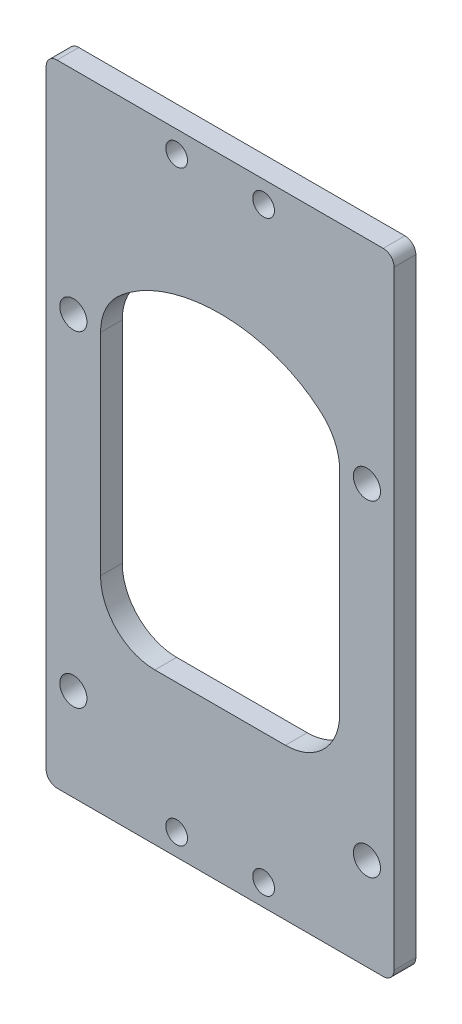
ISO-10303-21;
HEADER;
FILE_DESCRIPTION(('STEP AP214'),'2;1');
FILE_NAME('part.step','',(''),(''),'','','');
FILE_SCHEMA(('AUTOMOTIVE_DESIGN { 1 0 10303 214 1 1 1 1 }'));
ENDSEC;
DATA;
#1=APPLICATION_CONTEXT('core data for automotive mechanical design processes');
#2=APPLICATION_PROTOCOL_DEFINITION('international standard','automotive_design',2000,#1);
#3=PRODUCT_CONTEXT('',#1,'mechanical');
#4=PRODUCT('Part','Part','',(#3));
#5=PRODUCT_RELATED_PRODUCT_CATEGORY('part','',(#4));
#6=PRODUCT_DEFINITION_FORMATION('','',#4);
#7=PRODUCT_DEFINITION_CONTEXT('part definition',#1,'design');
#8=PRODUCT_DEFINITION('design','',#6,#7);
#9=PRODUCT_DEFINITION_SHAPE('','',#8);
#10=(LENGTH_UNIT() NAMED_UNIT(*) SI_UNIT(.MILLI.,.METRE.));
#11=(NAMED_UNIT(*) PLANE_ANGLE_UNIT() SI_UNIT($,.RADIAN.));
#12=(NAMED_UNIT(*) SI_UNIT($,.STERADIAN.) SOLID_ANGLE_UNIT());
#13=UNCERTAINTY_MEASURE_WITH_UNIT(LENGTH_MEASURE(1.E-05),#10,'distance_accuracy_value','');
#14=(GEOMETRIC_REPRESENTATION_CONTEXT(3) GLOBAL_UNCERTAINTY_ASSIGNED_CONTEXT((#13)) GLOBAL_UNIT_ASSIGNED_CONTEXT((#10,
#11,#12)) REPRESENTATION_CONTEXT('',''));
#15=CARTESIAN_POINT('',(0.,0.,0.));
#16=DIRECTION('',(0.,0.,1.));
#17=DIRECTION('',(1.,0.,0.));
#18=AXIS2_PLACEMENT_3D('',#15,#16,#17);
#19=CARTESIAN_POINT('',(-32.0000000000001,37.3006564364788,2.));
#20=DIRECTION('',(1.,0.,0.));
#21=DIRECTION('',(0.,1.,0.));
#22=AXIS2_PLACEMENT_3D('',#19,#20,#21);
#23=PLANE('',#22);
#24=DIRECTION('',(0.,-1.,0.));
#25=VECTOR('',#24,1.);
#26=CARTESIAN_POINT('',(-32.0000000000001,37.3006564364788,0.));
#27=LINE('',#26,#25);
#28=CARTESIAN_POINT('',(-32.0000000000002,50.9999999999999,0.));
#29=VERTEX_POINT('',#28);
#30=CARTESIAN_POINT('',(-32.,-5.,0.));
#31=VERTEX_POINT('',#30);
#32=EDGE_CURVE('E226',#29,#31,#27,.T.);
#33=ORIENTED_EDGE('',*,*,#32,.T.);
#34=DIRECTION('',(0.,0.,1.));
#35=VECTOR('',#34,1.);
#36=CARTESIAN_POINT('',(-32.,-5.,2.));
#37=LINE('',#36,#35);
#38=CARTESIAN_POINT('',(-32.,-5.,2.));
#39=VERTEX_POINT('',#38);
#40=EDGE_CURVE('E11',#31,#39,#37,.T.);
#41=ORIENTED_EDGE('',*,*,#40,.T.);
#42=DIRECTION('',(0.,-1.,0.));
#43=VECTOR('',#42,1.);
#44=CARTESIAN_POINT('',(-32.0000000000001,37.3006564364788,2.));
#45=LINE('',#44,#43);
#46=CARTESIAN_POINT('',(-32.0000000000002,50.9999999999999,2.));
#47=VERTEX_POINT('',#46);
#48=EDGE_CURVE('E228',#47,#39,#45,.T.);
#49=ORIENTED_EDGE('',*,*,#48,.F.);
#50=DIRECTION('',(0.,0.,-1.));
#51=VECTOR('',#50,1.);
#52=CARTESIAN_POINT('',(-32.0000000000002,50.9999999999999,0.));
#53=LINE('',#52,#51);
#54=EDGE_CURVE('E41',#47,#29,#53,.T.);
#55=ORIENTED_EDGE('',*,*,#54,.T.);
#56=EDGE_LOOP('',(#33,#41,#49,#55));
#57=FACE_BOUND('',#56,.T.);
#58=ADVANCED_FACE('F33',(#57),#23,.F.);
#59=CARTESIAN_POINT('',(10.932058708054,48.7327289101683,2.));
#60=DIRECTION('',(0.,0.,1.));
#61=DIRECTION('',(1.,0.,0.));
#62=AXIS2_PLACEMENT_3D('',#59,#60,#61);
#63=PLANE('',#62);
#64=CARTESIAN_POINT('',(-12.0000000000001,-4.,2.));
#65=DIRECTION('',(0.,0.,1.));
#66=DIRECTION('',(1.,0.,0.));
#67=AXIS2_PLACEMENT_3D('',#64,#65,#66);
#68=CIRCLE('',#67,1.);
#69=CARTESIAN_POINT('',(-11.0000000000001,-4.,2.));
#70=VERTEX_POINT('',#69);
#71=EDGE_CURVE('E436',#70,#70,#68,.T.);
#72=ORIENTED_EDGE('',*,*,#71,.F.);
#73=EDGE_LOOP('',(#72));
#74=FACE_BOUND('',#73,.T.);
#75=CARTESIAN_POINT('',(-20.0000000000001,-4.,2.));
#76=DIRECTION('',(0.,0.,1.));
#77=DIRECTION('',(1.,0.,0.));
#78=AXIS2_PLACEMENT_3D('',#75,#76,#77);
#79=CIRCLE('',#78,1.);
#80=CARTESIAN_POINT('',(-19.0000000000001,-4.,2.));
#81=VERTEX_POINT('',#80);
#82=EDGE_CURVE('E430',#81,#81,#79,.T.);
#83=ORIENTED_EDGE('',*,*,#82,.F.);
#84=EDGE_LOOP('',(#83));
#85=FACE_BOUND('',#84,.T.);
#86=CARTESIAN_POINT('',(-20.0000000000001,49.9999999999999,2.));
#87=DIRECTION('',(0.,0.,-1.));
#88=DIRECTION('',(-1.,0.,0.));
#89=AXIS2_PLACEMENT_3D('',#86,#87,#88);
#90=CIRCLE('',#89,1.);
#91=CARTESIAN_POINT('',(-21.0000000000001,49.9999999999999,2.));
#92=VERTEX_POINT('',#91);
#93=EDGE_CURVE('E416',#92,#92,#90,.T.);
#94=ORIENTED_EDGE('',*,*,#93,.T.);
#95=EDGE_LOOP('',(#94));
#96=FACE_BOUND('',#95,.T.);
#97=CARTESIAN_POINT('',(-12.0000000000001,49.9999999999999,2.));
#98=DIRECTION('',(0.,0.,-1.));
#99=DIRECTION('',(-1.,0.,0.));
#100=AXIS2_PLACEMENT_3D('',#97,#98,#99);
#101=CIRCLE('',#100,1.);
#102=CARTESIAN_POINT('',(-13.0000000000001,49.9999999999999,2.));
#103=VERTEX_POINT('',#102);
#104=EDGE_CURVE('E409',#103,#103,#101,.T.);
#105=ORIENTED_EDGE('',*,*,#104,.T.);
#106=EDGE_LOOP('',(#105));
#107=FACE_BOUND('',#106,.T.);
#108=DIRECTION('',(0.,-1.,0.));
#109=VECTOR('',#108,1.);
#110=CARTESIAN_POINT('',(0.,37.3006564364788,2.));
#111=LINE('',#110,#109);
#112=CARTESIAN_POINT('',(0.,50.9999999999999,2.));
#113=VERTEX_POINT('',#112);
#114=CARTESIAN_POINT('',(0.,-5.,2.));
#115=VERTEX_POINT('',#114);
#116=EDGE_CURVE('E238',#113,#115,#111,.T.);
#117=ORIENTED_EDGE('',*,*,#116,.F.);
#118=CARTESIAN_POINT('',(-1.00000000000001,50.9999999999999,2.));
#119=DIRECTION('',(0.,0.,1.));
#120=DIRECTION('',(1.,0.,0.));
#121=AXIS2_PLACEMENT_3D('',#118,#119,#120);
#122=CIRCLE('',#121,1.);
#123=CARTESIAN_POINT('',(-1.00000000000001,51.9999999999999,2.));
#124=VERTEX_POINT('',#123);
#125=EDGE_CURVE('E215',#113,#124,#122,.T.);
#126=ORIENTED_EDGE('',*,*,#125,.T.);
#127=DIRECTION('',(1.,0.,0.));
#128=VECTOR('',#127,1.);
#129=CARTESIAN_POINT('',(0.,51.9999999999999,2.));
#130=LINE('',#129,#128);
#131=CARTESIAN_POINT('',(-31.0000000000002,51.9999999999999,2.));
#132=VERTEX_POINT('',#131);
#133=EDGE_CURVE('E169',#132,#124,#130,.T.);
#134=ORIENTED_EDGE('',*,*,#133,.F.);
#135=CARTESIAN_POINT('',(-31.0000000000002,50.9999999999999,2.));
#136=DIRECTION('',(0.,0.,1.));
#137=DIRECTION('',(1.,0.,0.));
#138=AXIS2_PLACEMENT_3D('',#135,#136,#137);
#139=CIRCLE('',#138,1.);
#140=EDGE_CURVE('E211',#132,#47,#139,.T.);
#141=ORIENTED_EDGE('',*,*,#140,.T.);
#142=ORIENTED_EDGE('',*,*,#48,.T.);
#143=CARTESIAN_POINT('',(-31.,-5.,2.));
#144=DIRECTION('',(0.,0.,1.));
#145=DIRECTION('',(1.,0.,0.));
#146=AXIS2_PLACEMENT_3D('',#143,#144,#145);
#147=CIRCLE('',#146,1.);
#148=CARTESIAN_POINT('',(-31.,-6.,2.));
#149=VERTEX_POINT('',#148);
#150=EDGE_CURVE('E56',#39,#149,#147,.T.);
#151=ORIENTED_EDGE('',*,*,#150,.T.);
#152=DIRECTION('',(1.,0.,0.));
#153=VECTOR('',#152,1.);
#154=CARTESIAN_POINT('',(-32.0000000000001,-6.,2.));
#155=LINE('',#154,#153);
#156=CARTESIAN_POINT('',(-0.999999999999997,-6.,2.));
#157=VERTEX_POINT('',#156);
#158=EDGE_CURVE('E425',#149,#157,#155,.T.);
#159=ORIENTED_EDGE('',*,*,#158,.T.);
#160=CARTESIAN_POINT('',(-0.999999999999997,-5.,2.));
#161=DIRECTION('',(0.,0.,1.));
#162=DIRECTION('',(1.,0.,0.));
#163=AXIS2_PLACEMENT_3D('',#160,#161,#162);
#164=CIRCLE('',#163,1.);
#165=EDGE_CURVE('E48',#157,#115,#164,.T.);
#166=ORIENTED_EDGE('',*,*,#165,.T.);
#167=EDGE_LOOP('',(#117,#126,#134,#141,#142,#151,#159,#166));
#168=FACE_BOUND('',#167,.T.);
#169=CARTESIAN_POINT('',(-6.46446609406726,35.8361903424116,2.));
#170=CARTESIAN_POINT('',(-10.2644660940673,39.4148025629861,2.));
#171=CARTESIAN_POINT('',(-16.,40.3095891752314,2.));
#172=CARTESIAN_POINT('',(-21.7355339059327,39.4148025629861,2.));
#173=CARTESIAN_POINT('',(-25.5355339059327,35.8361903424116,2.));
#174=B_SPLINE_CURVE_WITH_KNOTS('',4,(#169,#170,#171,#172,#173),.UNSPECIFIED.,.F.,.F.,(5,5),(0.,
1.),.UNSPECIFIED.);
#175=CARTESIAN_POINT('',(-6.86985714354755,36.1996570389666,2.));
#176=VERTEX_POINT('',#175);
#177=CARTESIAN_POINT('',(-25.1301428564524,36.1996570389666,2.));
#178=VERTEX_POINT('',#177);
#179=EDGE_CURVE('E152',#176,#178,#174,.T.);
#180=ORIENTED_EDGE('',*,*,#179,.F.);
#181=CARTESIAN_POINT('',(-10.,32.3006564364789,2.));
#182=DIRECTION('',(0.,0.,1.));
#183=DIRECTION('',(1.,0.,0.));
#184=AXIS2_PLACEMENT_3D('',#181,#182,#183);
#185=CIRCLE('',#184,5.);
#186=CARTESIAN_POINT('',(-5.,32.3006564364789,2.));
#187=VERTEX_POINT('',#186);
#188=EDGE_CURVE('E164',#176,#187,#185,.F.);
#189=ORIENTED_EDGE('',*,*,#188,.T.);
#190=DIRECTION('',(0.,1.,0.));
#191=VECTOR('',#190,1.);
#192=CARTESIAN_POINT('',(-5.,37.3006564364788,2.));
#193=LINE('',#192,#191);
#194=CARTESIAN_POINT('',(-5.,12.9226186855977,2.));
#195=VERTEX_POINT('',#194);
#196=EDGE_CURVE('E274',#195,#187,#193,.T.);
#197=ORIENTED_EDGE('',*,*,#196,.F.);
#198=CARTESIAN_POINT('',(-10.,12.9226186855977,2.));
#199=DIRECTION('',(0.,0.,1.));
#200=DIRECTION('',(1.,0.,0.));
#201=AXIS2_PLACEMENT_3D('',#198,#199,#200);
#202=CIRCLE('',#201,5.);
#203=CARTESIAN_POINT('',(-10.,7.9226186855977,2.));
#204=VERTEX_POINT('',#203);
#205=EDGE_CURVE('E178',#195,#204,#202,.F.);
#206=ORIENTED_EDGE('',*,*,#205,.T.);
#207=DIRECTION('',(1.,0.,0.));
#208=VECTOR('',#207,1.);
#209=CARTESIAN_POINT('',(-5.,7.9226186855977,2.));
#210=LINE('',#209,#208);
#211=CARTESIAN_POINT('',(-22.,7.9226186855977,2.));
#212=VERTEX_POINT('',#211);
#213=EDGE_CURVE('E281',#212,#204,#210,.T.);
#214=ORIENTED_EDGE('',*,*,#213,.F.);
#215=CARTESIAN_POINT('',(-22.,12.9226186855977,2.));
#216=DIRECTION('',(0.,0.,1.));
#217=DIRECTION('',(1.,0.,0.));
#218=AXIS2_PLACEMENT_3D('',#215,#216,#217);
#219=CIRCLE('',#218,5.);
#220=CARTESIAN_POINT('',(-27.,12.9226186855977,2.));
#221=VERTEX_POINT('',#220);
#222=EDGE_CURVE('E187',#212,#221,#219,.F.);
#223=ORIENTED_EDGE('',*,*,#222,.T.);
#224=DIRECTION('',(0.,-1.,0.));
#225=VECTOR('',#224,1.);
#226=CARTESIAN_POINT('',(-27.,37.3006564364788,2.));
#227=LINE('',#226,#225);
#228=CARTESIAN_POINT('',(-27.,32.3006564364789,2.));
#229=VERTEX_POINT('',#228);
#230=EDGE_CURVE('E264',#229,#221,#227,.T.);
#231=ORIENTED_EDGE('',*,*,#230,.F.);
#232=CARTESIAN_POINT('',(-22.,32.3006564364789,2.));
#233=DIRECTION('',(0.,0.,1.));
#234=DIRECTION('',(1.,0.,0.));
#235=AXIS2_PLACEMENT_3D('',#232,#233,#234);
#236=CIRCLE('',#235,5.);
#237=EDGE_CURVE('E168',#229,#178,#236,.F.);
#238=ORIENTED_EDGE('',*,*,#237,.T.);
#239=EDGE_LOOP('',(#180,#189,#197,#206,#214,#223,#231,#238));
#240=FACE_BOUND('',#239,.T.);
#241=CARTESIAN_POINT('',(-2.5,2.5,2.));
#242=DIRECTION('',(0.,0.,1.));
#243=DIRECTION('',(1.,0.,0.));
#244=AXIS2_PLACEMENT_3D('',#241,#242,#243);
#245=CIRCLE('',#244,1.25);
#246=CARTESIAN_POINT('',(-1.25,2.5,2.));
#247=VERTEX_POINT('',#246);
#248=EDGE_CURVE('E308',#247,#247,#245,.T.);
#249=ORIENTED_EDGE('',*,*,#248,.F.);
#250=EDGE_LOOP('',(#249));
#251=FACE_BOUND('',#250,.T.);
#252=CARTESIAN_POINT('',(-29.5,2.5,2.));
#253=DIRECTION('',(0.,0.,1.));
#254=DIRECTION('',(1.,0.,0.));
#255=AXIS2_PLACEMENT_3D('',#252,#253,#254);
#256=CIRCLE('',#255,1.25);
#257=CARTESIAN_POINT('',(-28.25,2.5,2.));
#258=VERTEX_POINT('',#257);
#259=EDGE_CURVE('E302',#258,#258,#256,.T.);
#260=ORIENTED_EDGE('',*,*,#259,.F.);
#261=EDGE_LOOP('',(#260));
#262=FACE_BOUND('',#261,.T.);
#263=CARTESIAN_POINT('',(-29.5,32.5,2.));
#264=DIRECTION('',(0.,0.,1.));
#265=DIRECTION('',(1.,0.,0.));
#266=AXIS2_PLACEMENT_3D('',#263,#264,#265);
#267=CIRCLE('',#266,1.25);
#268=CARTESIAN_POINT('',(-28.25,32.5,2.));
#269=VERTEX_POINT('',#268);
#270=EDGE_CURVE('E158',#269,#269,#267,.T.);
#271=ORIENTED_EDGE('',*,*,#270,.F.);
#272=EDGE_LOOP('',(#271));
#273=FACE_BOUND('',#272,.T.);
#274=CARTESIAN_POINT('',(-2.5,32.5,2.));
#275=DIRECTION('',(0.,0.,1.));
#276=DIRECTION('',(1.,0.,0.));
#277=AXIS2_PLACEMENT_3D('',#274,#275,#276);
#278=CIRCLE('',#277,1.25);
#279=CARTESIAN_POINT('',(-1.25,32.5,2.));
#280=VERTEX_POINT('',#279);
#281=EDGE_CURVE('E291',#280,#280,#278,.T.);
#282=ORIENTED_EDGE('',*,*,#281,.F.);
#283=EDGE_LOOP('',(#282));
#284=FACE_BOUND('',#283,.T.);
#285=ADVANCED_FACE('F161',(#74,#85,#96,#107,#168,#240,#251,#262,#273,#284),#63,.T.);
#286=CARTESIAN_POINT('',(10.932058708054,48.7327289101683,0.));
#287=DIRECTION('',(0.,0.,1.));
#288=DIRECTION('',(1.,0.,0.));
#289=AXIS2_PLACEMENT_3D('',#286,#287,#288);
#290=PLANE('',#289);
#291=CARTESIAN_POINT('',(-12.0000000000001,-4.,0.));
#292=DIRECTION('',(0.,0.,1.));
#293=DIRECTION('',(1.,0.,0.));
#294=AXIS2_PLACEMENT_3D('',#291,#292,#293);
#295=CIRCLE('',#294,1.);
#296=CARTESIAN_POINT('',(-11.0000000000001,-4.,0.));
#297=VERTEX_POINT('',#296);
#298=EDGE_CURVE('E433',#297,#297,#295,.T.);
#299=ORIENTED_EDGE('',*,*,#298,.T.);
#300=EDGE_LOOP('',(#299));
#301=FACE_BOUND('',#300,.T.);
#302=CARTESIAN_POINT('',(-20.0000000000001,-4.,0.));
#303=DIRECTION('',(0.,0.,1.));
#304=DIRECTION('',(1.,0.,0.));
#305=AXIS2_PLACEMENT_3D('',#302,#303,#304);
#306=CIRCLE('',#305,1.);
#307=CARTESIAN_POINT('',(-19.0000000000001,-4.,0.));
#308=VERTEX_POINT('',#307);
#309=EDGE_CURVE('E427',#308,#308,#306,.T.);
#310=ORIENTED_EDGE('',*,*,#309,.T.);
#311=EDGE_LOOP('',(#310));
#312=FACE_BOUND('',#311,.T.);
#313=CARTESIAN_POINT('',(-20.0000000000001,49.9999999999999,0.));
#314=DIRECTION('',(0.,0.,-1.));
#315=DIRECTION('',(-1.,0.,0.));
#316=AXIS2_PLACEMENT_3D('',#313,#314,#315);
#317=CIRCLE('',#316,1.);
#318=CARTESIAN_POINT('',(-21.0000000000001,49.9999999999999,0.));
#319=VERTEX_POINT('',#318);
#320=EDGE_CURVE('E419',#319,#319,#317,.T.);
#321=ORIENTED_EDGE('',*,*,#320,.F.);
#322=EDGE_LOOP('',(#321));
#323=FACE_BOUND('',#322,.T.);
#324=CARTESIAN_POINT('',(-12.0000000000001,49.9999999999999,0.));
#325=DIRECTION('',(0.,0.,-1.));
#326=DIRECTION('',(-1.,0.,0.));
#327=AXIS2_PLACEMENT_3D('',#324,#325,#326);
#328=CIRCLE('',#327,1.);
#329=CARTESIAN_POINT('',(-13.0000000000001,49.9999999999999,0.));
#330=VERTEX_POINT('',#329);
#331=EDGE_CURVE('E411',#330,#330,#328,.T.);
#332=ORIENTED_EDGE('',*,*,#331,.F.);
#333=EDGE_LOOP('',(#332));
#334=FACE_BOUND('',#333,.T.);
#335=DIRECTION('',(1.,0.,0.));
#336=VECTOR('',#335,1.);
#337=CARTESIAN_POINT('',(0.,51.9999999999999,0.));
#338=LINE('',#337,#336);
#339=CARTESIAN_POINT('',(-31.0000000000002,51.9999999999999,0.));
#340=VERTEX_POINT('',#339);
#341=CARTESIAN_POINT('',(-1.00000000000001,51.9999999999999,0.));
#342=VERTEX_POINT('',#341);
#343=EDGE_CURVE('E328',#340,#342,#338,.T.);
#344=ORIENTED_EDGE('',*,*,#343,.T.);
#345=CARTESIAN_POINT('',(-1.00000000000001,50.9999999999999,0.));
#346=DIRECTION('',(0.,0.,1.));
#347=DIRECTION('',(1.,0.,0.));
#348=AXIS2_PLACEMENT_3D('',#345,#346,#347);
#349=CIRCLE('',#348,1.);
#350=CARTESIAN_POINT('',(0.,50.9999999999999,0.));
#351=VERTEX_POINT('',#350);
#352=EDGE_CURVE('E205',#342,#351,#349,.F.);
#353=ORIENTED_EDGE('',*,*,#352,.T.);
#354=DIRECTION('',(0.,-1.,0.));
#355=VECTOR('',#354,1.);
#356=CARTESIAN_POINT('',(0.,37.3006564364788,0.));
#357=LINE('',#356,#355);
#358=CARTESIAN_POINT('',(0.,-5.,0.));
#359=VERTEX_POINT('',#358);
#360=EDGE_CURVE('E243',#351,#359,#357,.T.);
#361=ORIENTED_EDGE('',*,*,#360,.T.);
#362=CARTESIAN_POINT('',(-0.999999999999997,-5.,0.));
#363=DIRECTION('',(0.,0.,1.));
#364=DIRECTION('',(1.,0.,0.));
#365=AXIS2_PLACEMENT_3D('',#362,#363,#364);
#366=CIRCLE('',#365,1.);
#367=CARTESIAN_POINT('',(-0.999999999999997,-6.,0.));
#368=VERTEX_POINT('',#367);
#369=EDGE_CURVE('E203',#359,#368,#366,.F.);
#370=ORIENTED_EDGE('',*,*,#369,.T.);
#371=DIRECTION('',(1.,0.,0.));
#372=VECTOR('',#371,1.);
#373=CARTESIAN_POINT('',(-32.0000000000001,-6.,0.));
#374=LINE('',#373,#372);
#375=CARTESIAN_POINT('',(-31.,-6.,0.));
#376=VERTEX_POINT('',#375);
#377=EDGE_CURVE('E422',#376,#368,#374,.T.);
#378=ORIENTED_EDGE('',*,*,#377,.F.);
#379=CARTESIAN_POINT('',(-31.,-5.,0.));
#380=DIRECTION('',(0.,0.,1.));
#381=DIRECTION('',(1.,0.,0.));
#382=AXIS2_PLACEMENT_3D('',#379,#380,#381);
#383=CIRCLE('',#382,1.);
#384=EDGE_CURVE('E201',#376,#31,#383,.F.);
#385=ORIENTED_EDGE('',*,*,#384,.T.);
#386=ORIENTED_EDGE('',*,*,#32,.F.);
#387=CARTESIAN_POINT('',(-31.0000000000002,50.9999999999999,0.));
#388=DIRECTION('',(0.,0.,1.));
#389=DIRECTION('',(1.,0.,0.));
#390=AXIS2_PLACEMENT_3D('',#387,#388,#389);
#391=CIRCLE('',#390,1.);
#392=EDGE_CURVE('E199',#29,#340,#391,.F.);
#393=ORIENTED_EDGE('',*,*,#392,.T.);
#394=EDGE_LOOP('',(#344,#353,#361,#370,#378,#385,#386,#393));
#395=FACE_BOUND('',#394,.T.);
#396=CARTESIAN_POINT('',(-2.5,2.5,0.));
#397=DIRECTION('',(0.,0.,1.));
#398=DIRECTION('',(1.,0.,0.));
#399=AXIS2_PLACEMENT_3D('',#396,#397,#398);
#400=CIRCLE('',#399,1.25);
#401=CARTESIAN_POINT('',(-1.25,2.5,0.));
#402=VERTEX_POINT('',#401);
#403=EDGE_CURVE('E294',#402,#402,#400,.T.);
#404=ORIENTED_EDGE('',*,*,#403,.T.);
#405=EDGE_LOOP('',(#404));
#406=FACE_BOUND('',#405,.T.);
#407=CARTESIAN_POINT('',(-29.5,2.5,0.));
#408=DIRECTION('',(0.,0.,1.));
#409=DIRECTION('',(1.,0.,0.));
#410=AXIS2_PLACEMENT_3D('',#407,#408,#409);
#411=CIRCLE('',#410,1.25);
#412=CARTESIAN_POINT('',(-28.25,2.5,0.));
#413=VERTEX_POINT('',#412);
#414=EDGE_CURVE('E305',#413,#413,#411,.T.);
#415=ORIENTED_EDGE('',*,*,#414,.T.);
#416=EDGE_LOOP('',(#415));
#417=FACE_BOUND('',#416,.T.);
#418=CARTESIAN_POINT('',(-29.5,32.5,0.));
#419=DIRECTION('',(0.,0.,1.));
#420=DIRECTION('',(1.,0.,0.));
#421=AXIS2_PLACEMENT_3D('',#418,#419,#420);
#422=CIRCLE('',#421,1.25);
#423=CARTESIAN_POINT('',(-28.25,32.5,0.));
#424=VERTEX_POINT('',#423);
#425=EDGE_CURVE('E299',#424,#424,#422,.T.);
#426=ORIENTED_EDGE('',*,*,#425,.T.);
#427=EDGE_LOOP('',(#426));
#428=FACE_BOUND('',#427,.T.);
#429=CARTESIAN_POINT('',(-2.5,32.5,0.));
#430=DIRECTION('',(0.,0.,1.));
#431=DIRECTION('',(1.,0.,0.));
#432=AXIS2_PLACEMENT_3D('',#429,#430,#431);
#433=CIRCLE('',#432,1.25);
#434=CARTESIAN_POINT('',(-1.25,32.5,0.));
#435=VERTEX_POINT('',#434);
#436=EDGE_CURVE('E277',#435,#435,#433,.T.);
#437=ORIENTED_EDGE('',*,*,#436,.T.);
#438=EDGE_LOOP('',(#437));
#439=FACE_BOUND('',#438,.T.);
#440=CARTESIAN_POINT('',(-10.,32.3006564364789,0.));
#441=DIRECTION('',(0.,0.,1.));
#442=DIRECTION('',(1.,0.,0.));
#443=AXIS2_PLACEMENT_3D('',#440,#441,#442);
#444=CIRCLE('',#443,5.);
#445=CARTESIAN_POINT('',(-5.,32.3006564364789,0.));
#446=VERTEX_POINT('',#445);
#447=CARTESIAN_POINT('',(-6.86985714354755,36.1996570389666,0.));
#448=VERTEX_POINT('',#447);
#449=EDGE_CURVE('E176',#446,#448,#444,.T.);
#450=ORIENTED_EDGE('',*,*,#449,.T.);
#451=CARTESIAN_POINT('',(-6.46446609406726,35.8361903424116,0.));
#452=CARTESIAN_POINT('',(-10.2644660940673,39.4148025629861,0.));
#453=CARTESIAN_POINT('',(-16.,40.3095891752314,0.));
#454=CARTESIAN_POINT('',(-21.7355339059327,39.4148025629861,0.));
#455=CARTESIAN_POINT('',(-25.5355339059327,35.8361903424116,0.));
#456=B_SPLINE_CURVE_WITH_KNOTS('',4,(#451,#452,#453,#454,#455),.UNSPECIFIED.,.F.,.F.,(5,5),(0.,
1.),.UNSPECIFIED.);
#457=CARTESIAN_POINT('',(-25.1301428564524,36.1996570389666,0.));
#458=VERTEX_POINT('',#457);
#459=EDGE_CURVE('E155',#448,#458,#456,.T.);
#460=ORIENTED_EDGE('',*,*,#459,.T.);
#461=CARTESIAN_POINT('',(-22.,32.3006564364789,0.));
#462=DIRECTION('',(0.,0.,1.));
#463=DIRECTION('',(1.,0.,0.));
#464=AXIS2_PLACEMENT_3D('',#461,#462,#463);
#465=CIRCLE('',#464,5.);
#466=CARTESIAN_POINT('',(-27.,32.3006564364789,0.));
#467=VERTEX_POINT('',#466);
#468=EDGE_CURVE('E189',#458,#467,#465,.T.);
#469=ORIENTED_EDGE('',*,*,#468,.T.);
#470=DIRECTION('',(0.,-1.,0.));
#471=VECTOR('',#470,1.);
#472=CARTESIAN_POINT('',(-27.,37.3006564364788,0.));
#473=LINE('',#472,#471);
#474=CARTESIAN_POINT('',(-27.,12.9226186855977,0.));
#475=VERTEX_POINT('',#474);
#476=EDGE_CURVE('E262',#467,#475,#473,.T.);
#477=ORIENTED_EDGE('',*,*,#476,.T.);
#478=CARTESIAN_POINT('',(-22.,12.9226186855977,0.));
#479=DIRECTION('',(0.,0.,1.));
#480=DIRECTION('',(1.,0.,0.));
#481=AXIS2_PLACEMENT_3D('',#478,#479,#480);
#482=CIRCLE('',#481,5.);
#483=CARTESIAN_POINT('',(-22.,7.9226186855977,0.));
#484=VERTEX_POINT('',#483);
#485=EDGE_CURVE('E185',#475,#484,#482,.T.);
#486=ORIENTED_EDGE('',*,*,#485,.T.);
#487=DIRECTION('',(1.,0.,0.));
#488=VECTOR('',#487,1.);
#489=CARTESIAN_POINT('',(-5.,7.9226186855977,0.));
#490=LINE('',#489,#488);
#491=CARTESIAN_POINT('',(-10.,7.9226186855977,0.));
#492=VERTEX_POINT('',#491);
#493=EDGE_CURVE('E271',#484,#492,#490,.T.);
#494=ORIENTED_EDGE('',*,*,#493,.T.);
#495=CARTESIAN_POINT('',(-10.,12.9226186855977,0.));
#496=DIRECTION('',(0.,0.,1.));
#497=DIRECTION('',(1.,0.,0.));
#498=AXIS2_PLACEMENT_3D('',#495,#496,#497);
#499=CIRCLE('',#498,5.);
#500=CARTESIAN_POINT('',(-5.,12.9226186855977,0.));
#501=VERTEX_POINT('',#500);
#502=EDGE_CURVE('E175',#492,#501,#499,.T.);
#503=ORIENTED_EDGE('',*,*,#502,.T.);
#504=DIRECTION('',(0.,1.,0.));
#505=VECTOR('',#504,1.);
#506=CARTESIAN_POINT('',(-5.,37.3006564364788,0.));
#507=LINE('',#506,#505);
#508=EDGE_CURVE('E272',#501,#446,#507,.T.);
#509=ORIENTED_EDGE('',*,*,#508,.T.);
#510=EDGE_LOOP('',(#450,#460,#469,#477,#486,#494,#503,#509));
#511=FACE_BOUND('',#510,.T.);
#512=ADVANCED_FACE('F233',(#301,#312,#323,#334,#395,#406,#417,#428,#439,#511),#290,.F.);
#513=CARTESIAN_POINT('',(0.,37.3006564364788,2.));
#514=DIRECTION('',(1.,0.,0.));
#515=DIRECTION('',(0.,1.,0.));
#516=AXIS2_PLACEMENT_3D('',#513,#514,#515);
#517=PLANE('',#516);
#518=ORIENTED_EDGE('',*,*,#360,.F.);
#519=DIRECTION('',(0.,0.,-1.));
#520=VECTOR('',#519,1.);
#521=CARTESIAN_POINT('',(0.,50.9999999999999,2.));
#522=LINE('',#521,#520);
#523=EDGE_CURVE('E209',#351,#113,#522,.F.);
#524=ORIENTED_EDGE('',*,*,#523,.T.);
#525=ORIENTED_EDGE('',*,*,#116,.T.);
#526=DIRECTION('',(0.,0.,1.));
#527=VECTOR('',#526,1.);
#528=CARTESIAN_POINT('',(0.,-5.,2.));
#529=LINE('',#528,#527);
#530=EDGE_CURVE('E207',#115,#359,#529,.F.);
#531=ORIENTED_EDGE('',*,*,#530,.T.);
#532=EDGE_LOOP('',(#518,#524,#525,#531));
#533=FACE_BOUND('',#532,.T.);
#534=ADVANCED_FACE('F364',(#533),#517,.T.);
#535=CARTESIAN_POINT('',(-5.,37.3006564364788,2.));
#536=DIRECTION('',(-1.,0.,0.));
#537=DIRECTION('',(0.,-1.,0.));
#538=AXIS2_PLACEMENT_3D('',#535,#536,#537);
#539=PLANE('',#538);
#540=ORIENTED_EDGE('',*,*,#196,.T.);
#541=DIRECTION('',(0.,0.,-1.));
#542=VECTOR('',#541,1.);
#543=CARTESIAN_POINT('',(-5.,32.3006564364789,0.));
#544=LINE('',#543,#542);
#545=EDGE_CURVE('E174',#187,#446,#544,.T.);
#546=ORIENTED_EDGE('',*,*,#545,.T.);
#547=ORIENTED_EDGE('',*,*,#508,.F.);
#548=DIRECTION('',(0.,0.,-1.));
#549=VECTOR('',#548,1.);
#550=CARTESIAN_POINT('',(-5.,12.9226186855977,2.));
#551=LINE('',#550,#549);
#552=EDGE_CURVE('E240',#501,#195,#551,.F.);
#553=ORIENTED_EDGE('',*,*,#552,.T.);
#554=EDGE_LOOP('',(#540,#546,#547,#553));
#555=FACE_BOUND('',#554,.T.);
#556=ADVANCED_FACE('F361',(#555),#539,.T.);
#557=CARTESIAN_POINT('',(-27.,37.3006564364788,2.));
#558=DIRECTION('',(1.,0.,0.));
#559=DIRECTION('',(0.,1.,0.));
#560=AXIS2_PLACEMENT_3D('',#557,#558,#559);
#561=PLANE('',#560);
#562=ORIENTED_EDGE('',*,*,#230,.T.);
#563=DIRECTION('',(0.,0.,-1.));
#564=VECTOR('',#563,1.);
#565=CARTESIAN_POINT('',(-27.,12.9226186855977,0.));
#566=LINE('',#565,#564);
#567=EDGE_CURVE('E180',#221,#475,#566,.T.);
#568=ORIENTED_EDGE('',*,*,#567,.T.);
#569=ORIENTED_EDGE('',*,*,#476,.F.);
#570=DIRECTION('',(0.,0.,-1.));
#571=VECTOR('',#570,1.);
#572=CARTESIAN_POINT('',(-27.,32.3006564364789,2.));
#573=LINE('',#572,#571);
#574=EDGE_CURVE('E254',#467,#229,#573,.F.);
#575=ORIENTED_EDGE('',*,*,#574,.T.);
#576=EDGE_LOOP('',(#562,#568,#569,#575));
#577=FACE_BOUND('',#576,.T.);
#578=ADVANCED_FACE('F261',(#577),#561,.T.);
#579=CARTESIAN_POINT('',(-5.,7.9226186855977,2.));
#580=DIRECTION('',(0.,1.,0.));
#581=DIRECTION('',(-1.,0.,0.));
#582=AXIS2_PLACEMENT_3D('',#579,#580,#581);
#583=PLANE('',#582);
#584=ORIENTED_EDGE('',*,*,#213,.T.);
#585=DIRECTION('',(0.,0.,-1.));
#586=VECTOR('',#585,1.);
#587=CARTESIAN_POINT('',(-10.,7.9226186855977,0.));
#588=LINE('',#587,#586);
#589=EDGE_CURVE('E251',#204,#492,#588,.T.);
#590=ORIENTED_EDGE('',*,*,#589,.T.);
#591=ORIENTED_EDGE('',*,*,#493,.F.);
#592=DIRECTION('',(0.,0.,-1.));
#593=VECTOR('',#592,1.);
#594=CARTESIAN_POINT('',(-22.,7.9226186855977,2.));
#595=LINE('',#594,#593);
#596=EDGE_CURVE('E249',#484,#212,#595,.F.);
#597=ORIENTED_EDGE('',*,*,#596,.T.);
#598=EDGE_LOOP('',(#584,#590,#591,#597));
#599=FACE_BOUND('',#598,.T.);
#600=ADVANCED_FACE('F356',(#599),#583,.T.);
#601=CARTESIAN_POINT('',(-10.,32.3006564364789,2.));
#602=DIRECTION('',(0.,0.,1.));
#603=DIRECTION('',(1.,0.,0.));
#604=AXIS2_PLACEMENT_3D('',#601,#602,#603);
#605=CYLINDRICAL_SURFACE('',#604,5.);
#606=ORIENTED_EDGE('',*,*,#545,.F.);
#607=ORIENTED_EDGE('',*,*,#188,.F.);
#608=DIRECTION('',(0.,0.,1.));
#609=VECTOR('',#608,1.);
#610=CARTESIAN_POINT('',(-6.86985714354755,36.1996570389666,-8.));
#611=LINE('',#610,#609);
#612=EDGE_CURVE('E149',#176,#448,#611,.F.);
#613=ORIENTED_EDGE('',*,*,#612,.T.);
#614=ORIENTED_EDGE('',*,*,#449,.F.);
#615=EDGE_LOOP('',(#606,#607,#613,#614));
#616=FACE_BOUND('',#615,.T.);
#617=ADVANCED_FACE('F172',(#616),#605,.F.);
#618=CARTESIAN_POINT('',(-10.,12.9226186855977,2.));
#619=DIRECTION('',(0.,0.,1.));
#620=DIRECTION('',(1.,0.,0.));
#621=AXIS2_PLACEMENT_3D('',#618,#619,#620);
#622=CYLINDRICAL_SURFACE('',#621,5.);
#623=ORIENTED_EDGE('',*,*,#205,.F.);
#624=ORIENTED_EDGE('',*,*,#552,.F.);
#625=ORIENTED_EDGE('',*,*,#502,.F.);
#626=ORIENTED_EDGE('',*,*,#589,.F.);
#627=EDGE_LOOP('',(#623,#624,#625,#626));
#628=FACE_BOUND('',#627,.T.);
#629=ADVANCED_FACE('F379',(#628),#622,.F.);
#630=CARTESIAN_POINT('',(-22.,12.9226186855977,2.));
#631=DIRECTION('',(0.,0.,1.));
#632=DIRECTION('',(1.,0.,0.));
#633=AXIS2_PLACEMENT_3D('',#630,#631,#632);
#634=CYLINDRICAL_SURFACE('',#633,5.);
#635=ORIENTED_EDGE('',*,*,#222,.F.);
#636=ORIENTED_EDGE('',*,*,#596,.F.);
#637=ORIENTED_EDGE('',*,*,#485,.F.);
#638=ORIENTED_EDGE('',*,*,#567,.F.);
#639=EDGE_LOOP('',(#635,#636,#637,#638));
#640=FACE_BOUND('',#639,.T.);
#641=ADVANCED_FACE('F382',(#640),#634,.F.);
#642=CARTESIAN_POINT('',(-22.,32.3006564364789,2.));
#643=DIRECTION('',(0.,0.,1.));
#644=DIRECTION('',(1.,0.,0.));
#645=AXIS2_PLACEMENT_3D('',#642,#643,#644);
#646=CYLINDRICAL_SURFACE('',#645,5.);
#647=ORIENTED_EDGE('',*,*,#574,.F.);
#648=ORIENTED_EDGE('',*,*,#468,.F.);
#649=DIRECTION('',(0.,0.,1.));
#650=VECTOR('',#649,1.);
#651=CARTESIAN_POINT('',(-25.1301428564524,36.1996570389666,-8.));
#652=LINE('',#651,#650);
#653=EDGE_CURVE('E192',#458,#178,#652,.T.);
#654=ORIENTED_EDGE('',*,*,#653,.T.);
#655=ORIENTED_EDGE('',*,*,#237,.F.);
#656=EDGE_LOOP('',(#647,#648,#654,#655));
#657=FACE_BOUND('',#656,.T.);
#658=ADVANCED_FACE('F354',(#657),#646,.F.);
#659=CARTESIAN_POINT('',(-2.5,32.5,0.));
#660=DIRECTION('',(0.,0.,1.));
#661=DIRECTION('',(1.,0.,0.));
#662=AXIS2_PLACEMENT_3D('',#659,#660,#661);
#663=CYLINDRICAL_SURFACE('',#662,1.25);
#664=ORIENTED_EDGE('',*,*,#436,.F.);
#665=EDGE_LOOP('',(#664));
#666=FACE_BOUND('',#665,.T.);
#667=ORIENTED_EDGE('',*,*,#281,.T.);
#668=EDGE_LOOP('',(#667));
#669=FACE_BOUND('',#668,.T.);
#670=ADVANCED_FACE('F350',(#666,#669),#663,.F.);
#671=CARTESIAN_POINT('',(-29.5,32.5,0.));
#672=DIRECTION('',(0.,0.,1.));
#673=DIRECTION('',(1.,0.,0.));
#674=AXIS2_PLACEMENT_3D('',#671,#672,#673);
#675=CYLINDRICAL_SURFACE('',#674,1.25);
#676=ORIENTED_EDGE('',*,*,#425,.F.);
#677=EDGE_LOOP('',(#676));
#678=FACE_BOUND('',#677,.T.);
#679=ORIENTED_EDGE('',*,*,#270,.T.);
#680=EDGE_LOOP('',(#679));
#681=FACE_BOUND('',#680,.T.);
#682=ADVANCED_FACE('F346',(#678,#681),#675,.F.);
#683=CARTESIAN_POINT('',(-29.5,2.5,0.));
#684=DIRECTION('',(0.,0.,1.));
#685=DIRECTION('',(1.,0.,0.));
#686=AXIS2_PLACEMENT_3D('',#683,#684,#685);
#687=CYLINDRICAL_SURFACE('',#686,1.25);
#688=ORIENTED_EDGE('',*,*,#414,.F.);
#689=EDGE_LOOP('',(#688));
#690=FACE_BOUND('',#689,.T.);
#691=ORIENTED_EDGE('',*,*,#259,.T.);
#692=EDGE_LOOP('',(#691));
#693=FACE_BOUND('',#692,.T.);
#694=ADVANCED_FACE('F342',(#690,#693),#687,.F.);
#695=CARTESIAN_POINT('',(-2.5,2.5,0.));
#696=DIRECTION('',(0.,0.,1.));
#697=DIRECTION('',(1.,0.,0.));
#698=AXIS2_PLACEMENT_3D('',#695,#696,#697);
#699=CYLINDRICAL_SURFACE('',#698,1.25);
#700=ORIENTED_EDGE('',*,*,#403,.F.);
#701=EDGE_LOOP('',(#700));
#702=FACE_BOUND('',#701,.T.);
#703=ORIENTED_EDGE('',*,*,#248,.T.);
#704=EDGE_LOOP('',(#703));
#705=FACE_BOUND('',#704,.T.);
#706=ADVANCED_FACE('F338',(#702,#705),#699,.F.);
#707=CARTESIAN_POINT('',(-6.46446609406726,35.8361903424116,-8.));
#708=CARTESIAN_POINT('',(-10.2644660940673,39.4148025629861,-8.));
#709=CARTESIAN_POINT('',(-16.,40.3095891752314,-8.));
#710=CARTESIAN_POINT('',(-21.7355339059327,39.4148025629861,-8.));
#711=CARTESIAN_POINT('',(-25.5355339059327,35.8361903424116,-8.));
#712=B_SPLINE_CURVE_WITH_KNOTS('',4,(#707,#708,#709,#710,#711),.UNSPECIFIED.,.F.,.F.,(5,5),(0.,
1.),.UNSPECIFIED.);
#713=DIRECTION('',(0.,0.,1.));
#714=VECTOR('',#713,1.);
#715=SURFACE_OF_LINEAR_EXTRUSION('',#712,#714);
#716=ORIENTED_EDGE('',*,*,#179,.T.);
#717=ORIENTED_EDGE('',*,*,#653,.F.);
#718=ORIENTED_EDGE('',*,*,#459,.F.);
#719=ORIENTED_EDGE('',*,*,#612,.F.);
#720=EDGE_LOOP('',(#716,#717,#718,#719));
#721=FACE_BOUND('',#720,.T.);
#722=ADVANCED_FACE('F151',(#721),#715,.F.);
#723=CARTESIAN_POINT('',(0.,51.9999999999999,2.));
#724=DIRECTION('',(0.,1.,0.));
#725=DIRECTION('',(0.,0.,1.));
#726=AXIS2_PLACEMENT_3D('',#723,#724,#725);
#727=PLANE('',#726);
#728=ORIENTED_EDGE('',*,*,#133,.T.);
#729=DIRECTION('',(0.,0.,-1.));
#730=VECTOR('',#729,1.);
#731=CARTESIAN_POINT('',(-1.00000000000001,51.9999999999999,2.));
#732=LINE('',#731,#730);
#733=EDGE_CURVE('E196',#124,#342,#732,.T.);
#734=ORIENTED_EDGE('',*,*,#733,.T.);
#735=ORIENTED_EDGE('',*,*,#343,.F.);
#736=DIRECTION('',(0.,0.,-1.));
#737=VECTOR('',#736,1.);
#738=CARTESIAN_POINT('',(-31.0000000000002,51.9999999999999,2.));
#739=LINE('',#738,#737);
#740=EDGE_CURVE('E194',#340,#132,#739,.F.);
#741=ORIENTED_EDGE('',*,*,#740,.T.);
#742=EDGE_LOOP('',(#728,#734,#735,#741));
#743=FACE_BOUND('',#742,.T.);
#744=ADVANCED_FACE('F337',(#743),#727,.T.);
#745=CARTESIAN_POINT('',(-12.0000000000001,49.9999999999999,2.));
#746=DIRECTION('',(0.,0.,-1.));
#747=DIRECTION('',(-1.,0.,0.));
#748=AXIS2_PLACEMENT_3D('',#745,#746,#747);
#749=CYLINDRICAL_SURFACE('',#748,1.);
#750=ORIENTED_EDGE('',*,*,#104,.F.);
#751=EDGE_LOOP('',(#750));
#752=FACE_BOUND('',#751,.T.);
#753=ORIENTED_EDGE('',*,*,#331,.T.);
#754=EDGE_LOOP('',(#753));
#755=FACE_BOUND('',#754,.T.);
#756=ADVANCED_FACE('F457',(#752,#755),#749,.F.);
#757=CARTESIAN_POINT('',(-20.0000000000001,49.9999999999999,2.));
#758=DIRECTION('',(0.,0.,-1.));
#759=DIRECTION('',(-1.,0.,0.));
#760=AXIS2_PLACEMENT_3D('',#757,#758,#759);
#761=CYLINDRICAL_SURFACE('',#760,1.);
#762=ORIENTED_EDGE('',*,*,#93,.F.);
#763=EDGE_LOOP('',(#762));
#764=FACE_BOUND('',#763,.T.);
#765=ORIENTED_EDGE('',*,*,#320,.T.);
#766=EDGE_LOOP('',(#765));
#767=FACE_BOUND('',#766,.T.);
#768=ADVANCED_FACE('F453',(#764,#767),#761,.F.);
#769=CARTESIAN_POINT('',(-32.0000000000001,-6.,0.));
#770=DIRECTION('',(0.,-1.,0.));
#771=DIRECTION('',(0.,0.,-1.));
#772=AXIS2_PLACEMENT_3D('',#769,#770,#771);
#773=PLANE('',#772);
#774=ORIENTED_EDGE('',*,*,#377,.T.);
#775=DIRECTION('',(0.,0.,1.));
#776=VECTOR('',#775,1.);
#777=CARTESIAN_POINT('',(-0.999999999999997,-6.,0.));
#778=LINE('',#777,#776);
#779=EDGE_CURVE('E219',#368,#157,#778,.T.);
#780=ORIENTED_EDGE('',*,*,#779,.T.);
#781=ORIENTED_EDGE('',*,*,#158,.F.);
#782=DIRECTION('',(0.,0.,1.));
#783=VECTOR('',#782,1.);
#784=CARTESIAN_POINT('',(-31.,-6.,0.));
#785=LINE('',#784,#783);
#786=EDGE_CURVE('E217',#149,#376,#785,.F.);
#787=ORIENTED_EDGE('',*,*,#786,.T.);
#788=EDGE_LOOP('',(#774,#780,#781,#787));
#789=FACE_BOUND('',#788,.T.);
#790=ADVANCED_FACE('F456',(#789),#773,.T.);
#791=CARTESIAN_POINT('',(-20.0000000000001,-4.,0.));
#792=DIRECTION('',(0.,0.,1.));
#793=DIRECTION('',(1.,0.,0.));
#794=AXIS2_PLACEMENT_3D('',#791,#792,#793);
#795=CYLINDRICAL_SURFACE('',#794,1.);
#796=ORIENTED_EDGE('',*,*,#309,.F.);
#797=EDGE_LOOP('',(#796));
#798=FACE_BOUND('',#797,.T.);
#799=ORIENTED_EDGE('',*,*,#82,.T.);
#800=EDGE_LOOP('',(#799));
#801=FACE_BOUND('',#800,.T.);
#802=ADVANCED_FACE('F445',(#798,#801),#795,.F.);
#803=CARTESIAN_POINT('',(-12.0000000000001,-4.,0.));
#804=DIRECTION('',(0.,0.,1.));
#805=DIRECTION('',(1.,0.,0.));
#806=AXIS2_PLACEMENT_3D('',#803,#804,#805);
#807=CYLINDRICAL_SURFACE('',#806,1.);
#808=ORIENTED_EDGE('',*,*,#298,.F.);
#809=EDGE_LOOP('',(#808));
#810=FACE_BOUND('',#809,.T.);
#811=ORIENTED_EDGE('',*,*,#71,.T.);
#812=EDGE_LOOP('',(#811));
#813=FACE_BOUND('',#812,.T.);
#814=ADVANCED_FACE('F393',(#810,#813),#807,.F.);
#815=CARTESIAN_POINT('',(-1.00000000000001,50.9999999999999,2.));
#816=DIRECTION('',(0.,0.,-1.));
#817=DIRECTION('',(-1.,0.,0.));
#818=AXIS2_PLACEMENT_3D('',#815,#816,#817);
#819=CYLINDRICAL_SURFACE('',#818,1.);
#820=ORIENTED_EDGE('',*,*,#125,.F.);
#821=ORIENTED_EDGE('',*,*,#523,.F.);
#822=ORIENTED_EDGE('',*,*,#352,.F.);
#823=ORIENTED_EDGE('',*,*,#733,.F.);
#824=EDGE_LOOP('',(#820,#821,#822,#823));
#825=FACE_BOUND('',#824,.T.);
#826=ADVANCED_FACE('F389',(#825),#819,.T.);
#827=CARTESIAN_POINT('',(-0.999999999999997,-5.,0.));
#828=DIRECTION('',(0.,0.,1.));
#829=DIRECTION('',(1.,0.,0.));
#830=AXIS2_PLACEMENT_3D('',#827,#828,#829);
#831=CYLINDRICAL_SURFACE('',#830,1.);
#832=ORIENTED_EDGE('',*,*,#369,.F.);
#833=ORIENTED_EDGE('',*,*,#530,.F.);
#834=ORIENTED_EDGE('',*,*,#165,.F.);
#835=ORIENTED_EDGE('',*,*,#779,.F.);
#836=EDGE_LOOP('',(#832,#833,#834,#835));
#837=FACE_BOUND('',#836,.T.);
#838=ADVANCED_FACE('F392',(#837),#831,.T.);
#839=CARTESIAN_POINT('',(-31.,-5.,2.));
#840=DIRECTION('',(0.,0.,-1.));
#841=DIRECTION('',(-1.,0.,0.));
#842=AXIS2_PLACEMENT_3D('',#839,#840,#841);
#843=CYLINDRICAL_SURFACE('',#842,1.);
#844=ORIENTED_EDGE('',*,*,#384,.F.);
#845=ORIENTED_EDGE('',*,*,#786,.F.);
#846=ORIENTED_EDGE('',*,*,#150,.F.);
#847=ORIENTED_EDGE('',*,*,#40,.F.);
#848=EDGE_LOOP('',(#844,#845,#846,#847));
#849=FACE_BOUND('',#848,.T.);
#850=ADVANCED_FACE('F396',(#849),#843,.T.);
#851=CARTESIAN_POINT('',(-31.0000000000002,50.9999999999999,2.));
#852=DIRECTION('',(0.,0.,1.));
#853=DIRECTION('',(1.,0.,0.));
#854=AXIS2_PLACEMENT_3D('',#851,#852,#853);
#855=CYLINDRICAL_SURFACE('',#854,1.);
#856=ORIENTED_EDGE('',*,*,#140,.F.);
#857=ORIENTED_EDGE('',*,*,#740,.F.);
#858=ORIENTED_EDGE('',*,*,#392,.F.);
#859=ORIENTED_EDGE('',*,*,#54,.F.);
#860=EDGE_LOOP('',(#856,#857,#858,#859));
#861=FACE_BOUND('',#860,.T.);
#862=ADVANCED_FACE('F35',(#861),#855,.T.);
#863=CLOSED_SHELL('',(#58,#285,#512,#534,#556,#578,#600,#617,#629,#641,#658,#670,#682,#694,#706,
#722,#744,#756,#768,#790,#802,#814,#826,#838,#850,#862));
#864=MANIFOLD_SOLID_BREP('B2',#863);
#865=ADVANCED_BREP_SHAPE_REPRESENTATION('',(#18,#864),#14);
#866=SHAPE_DEFINITION_REPRESENTATION(#9,#865);
ENDSEC;
END-ISO-10303-21;
